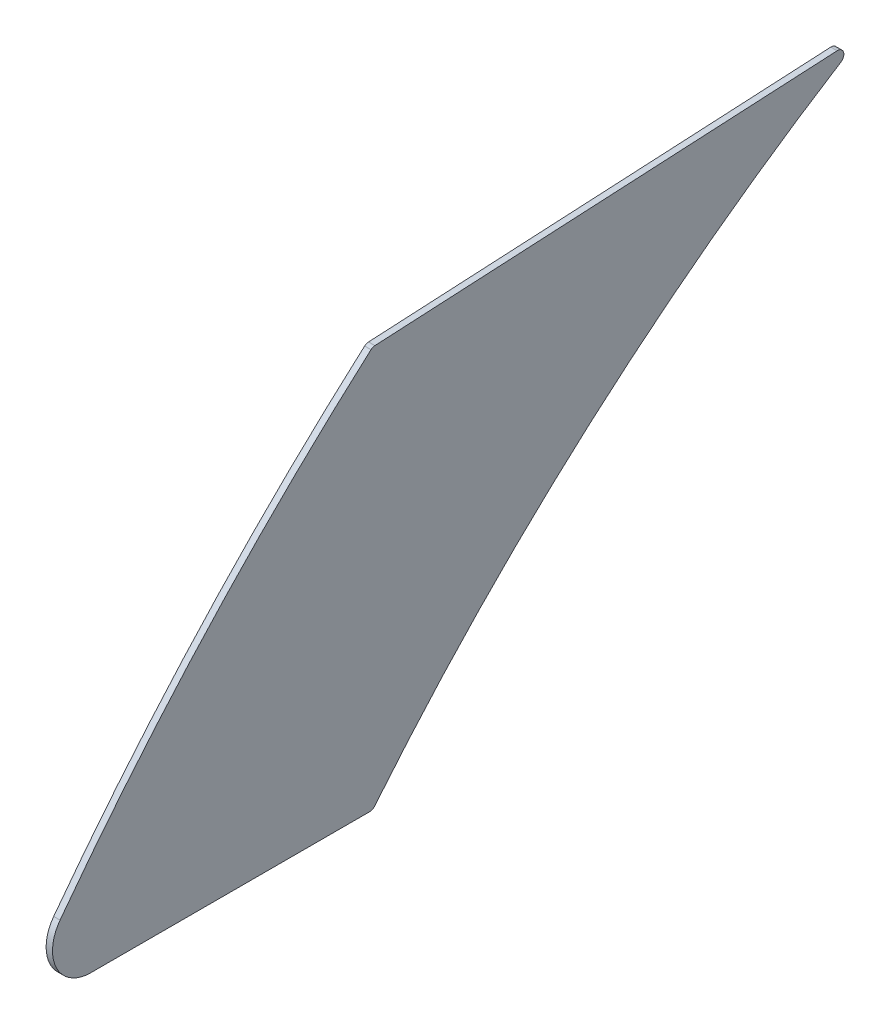
ISO-10303-21;
HEADER;
FILE_DESCRIPTION(('STEP AP214'),'2;1');
FILE_NAME('part.step','',(''),(''),'','','');
FILE_SCHEMA(('AUTOMOTIVE_DESIGN { 1 0 10303 214 1 1 1 1 }'));
ENDSEC;
DATA;
#1=APPLICATION_CONTEXT('core data for automotive mechanical design processes');
#2=APPLICATION_PROTOCOL_DEFINITION('international standard','automotive_design',2000,#1);
#3=PRODUCT_CONTEXT('',#1,'mechanical');
#4=PRODUCT('Part','Part','',(#3));
#5=PRODUCT_RELATED_PRODUCT_CATEGORY('part','',(#4));
#6=PRODUCT_DEFINITION_FORMATION('','',#4);
#7=PRODUCT_DEFINITION_CONTEXT('part definition',#1,'design');
#8=PRODUCT_DEFINITION('design','',#6,#7);
#9=PRODUCT_DEFINITION_SHAPE('','',#8);
#10=(LENGTH_UNIT() NAMED_UNIT(*) SI_UNIT(.MILLI.,.METRE.));
#11=(NAMED_UNIT(*) PLANE_ANGLE_UNIT() SI_UNIT($,.RADIAN.));
#12=(NAMED_UNIT(*) SI_UNIT($,.STERADIAN.) SOLID_ANGLE_UNIT());
#13=UNCERTAINTY_MEASURE_WITH_UNIT(LENGTH_MEASURE(1.E-05),#10,'distance_accuracy_value','');
#14=(GEOMETRIC_REPRESENTATION_CONTEXT(3) GLOBAL_UNCERTAINTY_ASSIGNED_CONTEXT((#13)) GLOBAL_UNIT_ASSIGNED_CONTEXT((#10,
#11,#12)) REPRESENTATION_CONTEXT('',''));
#15=CARTESIAN_POINT('',(0.,0.,0.));
#16=DIRECTION('',(0.,0.,1.));
#17=DIRECTION('',(1.,0.,0.));
#18=AXIS2_PLACEMENT_3D('',#15,#16,#17);
#19=CARTESIAN_POINT('',(1.,-57.,44.3054831138269));
#20=DIRECTION('',(-1.,0.,0.));
#21=DIRECTION('',(0.,0.,1.));
#22=AXIS2_PLACEMENT_3D('',#19,#20,#21);
#23=CYLINDRICAL_SURFACE('',#22,6.00000000000001);
#24=CARTESIAN_POINT('',(0.,-57.,44.3054831138269));
#25=DIRECTION('',(1.,0.,0.));
#26=DIRECTION('',(0.,0.,1.));
#27=AXIS2_PLACEMENT_3D('',#24,#25,#26);
#28=CIRCLE('',#27,6.00000000000001);
#29=CARTESIAN_POINT('',(0.,-53.4185692233311,49.11935407096));
#30=VERTEX_POINT('',#29);
#31=CARTESIAN_POINT('',(0.,-63.,44.3054831138269));
#32=VERTEX_POINT('',#31);
#33=EDGE_CURVE('E129',#30,#32,#28,.T.);
#34=ORIENTED_EDGE('',*,*,#33,.T.);
#35=DIRECTION('',(-1.,0.,0.));
#36=VECTOR('',#35,1.);
#37=CARTESIAN_POINT('',(1.,-63.,44.3054831138269));
#38=LINE('',#37,#36);
#39=CARTESIAN_POINT('',(1.,-63.,44.3054831138269));
#40=VERTEX_POINT('',#39);
#41=EDGE_CURVE('E11',#40,#32,#38,.T.);
#42=ORIENTED_EDGE('',*,*,#41,.F.);
#43=CARTESIAN_POINT('',(1.,-57.,44.3054831138269));
#44=DIRECTION('',(1.,0.,0.));
#45=DIRECTION('',(0.,0.,1.));
#46=AXIS2_PLACEMENT_3D('',#43,#44,#45);
#47=CIRCLE('',#46,6.00000000000001);
#48=CARTESIAN_POINT('',(1.,-53.4185692233311,49.11935407096));
#49=VERTEX_POINT('',#48);
#50=EDGE_CURVE('E143',#49,#40,#47,.T.);
#51=ORIENTED_EDGE('',*,*,#50,.F.);
#52=DIRECTION('',(-1.,0.,0.));
#53=VECTOR('',#52,1.);
#54=CARTESIAN_POINT('',(1.,-53.4185692233311,49.11935407096));
#55=LINE('',#54,#53);
#56=EDGE_CURVE('E125',#49,#30,#55,.T.);
#57=ORIENTED_EDGE('',*,*,#56,.T.);
#58=EDGE_LOOP('',(#34,#42,#51,#57));
#59=FACE_BOUND('',#58,.T.);
#60=ADVANCED_FACE('F33',(#59),#23,.T.);
#61=CARTESIAN_POINT('',(1.,-63.,44.3054831138269));
#62=DIRECTION('',(0.,1.,0.));
#63=DIRECTION('',(0.,0.,1.));
#64=AXIS2_PLACEMENT_3D('',#61,#62,#63);
#65=PLANE('',#64);
#66=DIRECTION('',(0.,0.,-1.));
#67=VECTOR('',#66,1.);
#68=CARTESIAN_POINT('',(0.,-63.,44.3054831138269));
#69=LINE('',#68,#67);
#70=CARTESIAN_POINT('',(0.,-63.,0.475074433169964));
#71=VERTEX_POINT('',#70);
#72=EDGE_CURVE('E132',#32,#71,#69,.T.);
#73=ORIENTED_EDGE('',*,*,#72,.T.);
#74=DIRECTION('',(-1.,0.,0.));
#75=VECTOR('',#74,1.);
#76=CARTESIAN_POINT('',(1.,-63.,0.475074433169964));
#77=LINE('',#76,#75);
#78=CARTESIAN_POINT('',(1.,-63.,0.475074433169964));
#79=VERTEX_POINT('',#78);
#80=EDGE_CURVE('E41',#79,#71,#77,.T.);
#81=ORIENTED_EDGE('',*,*,#80,.F.);
#82=DIRECTION('',(0.,0.,-1.));
#83=VECTOR('',#82,1.);
#84=CARTESIAN_POINT('',(1.,-63.,44.3054831138269));
#85=LINE('',#84,#83);
#86=EDGE_CURVE('E92',#40,#79,#85,.T.);
#87=ORIENTED_EDGE('',*,*,#86,.F.);
#88=ORIENTED_EDGE('',*,*,#41,.T.);
#89=EDGE_LOOP('',(#73,#81,#87,#88));
#90=FACE_BOUND('',#89,.T.);
#91=ADVANCED_FACE('F178',(#90),#65,.F.);
#92=CARTESIAN_POINT('',(1.,-62.,0.475074433169964));
#93=DIRECTION('',(-1.,0.,0.));
#94=DIRECTION('',(0.,0.,1.));
#95=AXIS2_PLACEMENT_3D('',#92,#93,#94);
#96=CYLINDRICAL_SURFACE('',#95,1.);
#97=CARTESIAN_POINT('',(0.,-62.,0.475074433169964));
#98=DIRECTION('',(1.,0.,0.));
#99=DIRECTION('',(0.,0.,-1.));
#100=AXIS2_PLACEMENT_3D('',#97,#98,#99);
#101=CIRCLE('',#100,1.);
#102=CARTESIAN_POINT('',(0.,-62.6323384132984,-0.299617848363327));
#103=VERTEX_POINT('',#102);
#104=EDGE_CURVE('E134',#71,#103,#101,.T.);
#105=ORIENTED_EDGE('',*,*,#104,.T.);
#106=DIRECTION('',(-1.,0.,0.));
#107=VECTOR('',#106,1.);
#108=CARTESIAN_POINT('',(1.,-62.6323384132984,-0.299617848363327));
#109=LINE('',#108,#107);
#110=CARTESIAN_POINT('',(1.,-62.6323384132984,-0.299617848363327));
#111=VERTEX_POINT('',#110);
#112=EDGE_CURVE('E150',#111,#103,#109,.T.);
#113=ORIENTED_EDGE('',*,*,#112,.F.);
#114=CARTESIAN_POINT('',(1.,-62.,0.475074433169964));
#115=DIRECTION('',(1.,0.,0.));
#116=DIRECTION('',(0.,0.,-1.));
#117=AXIS2_PLACEMENT_3D('',#114,#115,#116);
#118=CIRCLE('',#117,1.);
#119=EDGE_CURVE('E158',#79,#111,#118,.T.);
#120=ORIENTED_EDGE('',*,*,#119,.F.);
#121=ORIENTED_EDGE('',*,*,#80,.T.);
#122=EDGE_LOOP('',(#105,#113,#120,#121));
#123=FACE_BOUND('',#122,.T.);
#124=ADVANCED_FACE('F156',(#123),#96,.T.);
#125=CARTESIAN_POINT('',(1.,-252.33386240282,-232.70730230835));
#126=DIRECTION('',(-1.,0.,0.));
#127=DIRECTION('',(0.,0.,1.));
#128=AXIS2_PLACEMENT_3D('',#125,#126,#127);
#129=CYLINDRICAL_SURFACE('',#128,300.);
#130=CARTESIAN_POINT('',(0.,-252.33386240282,-232.70730230835));
#131=DIRECTION('',(-1.,0.,0.));
#132=DIRECTION('',(0.,0.,1.));
#133=AXIS2_PLACEMENT_3D('',#130,#131,#132);
#134=CIRCLE('',#133,300.);
#135=CARTESIAN_POINT('',(0.,1.97868552855796,-73.5685956256248));
#136=VERTEX_POINT('',#135);
#137=EDGE_CURVE('E136',#103,#136,#134,.T.);
#138=ORIENTED_EDGE('',*,*,#137,.T.);
#139=DIRECTION('',(-1.,0.,0.));
#140=VECTOR('',#139,1.);
#141=CARTESIAN_POINT('',(1.,1.97868552855796,-73.5685956256248));
#142=LINE('',#141,#140);
#143=CARTESIAN_POINT('',(1.,1.97868552855796,-73.5685956256248));
#144=VERTEX_POINT('',#143);
#145=EDGE_CURVE('E147',#144,#136,#142,.T.);
#146=ORIENTED_EDGE('',*,*,#145,.F.);
#147=CARTESIAN_POINT('',(1.,-252.33386240282,-232.70730230835));
#148=DIRECTION('',(-1.,0.,0.));
#149=DIRECTION('',(0.,0.,1.));
#150=AXIS2_PLACEMENT_3D('',#147,#148,#149);
#151=CIRCLE('',#150,300.);
#152=EDGE_CURVE('E170',#111,#144,#151,.T.);
#153=ORIENTED_EDGE('',*,*,#152,.F.);
#154=ORIENTED_EDGE('',*,*,#112,.T.);
#155=EDGE_LOOP('',(#138,#146,#153,#154));
#156=FACE_BOUND('',#155,.T.);
#157=ADVANCED_FACE('F166',(#156),#129,.F.);
#158=CARTESIAN_POINT('',(1.,2.82639402166245,-73.0381332700157));
#159=DIRECTION('',(-1.,0.,0.));
#160=DIRECTION('',(0.,0.,1.));
#161=AXIS2_PLACEMENT_3D('',#158,#159,#160);
#162=CYLINDRICAL_SURFACE('',#161,0.99999999999995);
#163=CARTESIAN_POINT('',(0.,2.82639402166245,-73.0381332700157));
#164=DIRECTION('',(1.,0.,0.));
#165=DIRECTION('',(0.,0.,1.));
#166=AXIS2_PLACEMENT_3D('',#163,#164,#165);
#167=CIRCLE('',#166,0.99999999999995);
#168=CARTESIAN_POINT('',(0.,3.82502355641698,-72.9857973137728));
#169=VERTEX_POINT('',#168);
#170=EDGE_CURVE('E138',#136,#169,#167,.T.);
#171=ORIENTED_EDGE('',*,*,#170,.T.);
#172=DIRECTION('',(-1.,0.,0.));
#173=VECTOR('',#172,1.);
#174=CARTESIAN_POINT('',(1.,3.82502355641698,-72.9857973137728));
#175=LINE('',#174,#173);
#176=CARTESIAN_POINT('',(1.,3.82502355641698,-72.9857973137728));
#177=VERTEX_POINT('',#176);
#178=EDGE_CURVE('E120',#177,#169,#175,.T.);
#179=ORIENTED_EDGE('',*,*,#178,.F.);
#180=CARTESIAN_POINT('',(1.,2.82639402166245,-73.0381332700157));
#181=DIRECTION('',(1.,0.,0.));
#182=DIRECTION('',(0.,0.,1.));
#183=AXIS2_PLACEMENT_3D('',#180,#181,#182);
#184=CIRCLE('',#183,0.99999999999995);
#185=EDGE_CURVE('E111',#144,#177,#184,.T.);
#186=ORIENTED_EDGE('',*,*,#185,.F.);
#187=ORIENTED_EDGE('',*,*,#145,.T.);
#188=EDGE_LOOP('',(#171,#179,#186,#187));
#189=FACE_BOUND('',#188,.T.);
#190=ADVANCED_FACE('F169',(#189),#162,.T.);
#191=CARTESIAN_POINT('',(1.,0.0182657429983053,-0.348531138853574));
#192=DIRECTION('',(0.,-0.998629534754574,-0.0523359562429444));
#193=DIRECTION('',(0.,0.0523359562429444,-0.998629534754574));
#194=AXIS2_PLACEMENT_3D('',#191,#192,#193);
#195=PLANE('',#194);
#196=DIRECTION('',(0.,-0.0523359562429444,0.998629534754574));
#197=VECTOR('',#196,1.);
#198=CARTESIAN_POINT('',(0.,0.0182657429983053,-0.348531138853574));
#199=LINE('',#198,#197);
#200=CARTESIAN_POINT('',(0.,0.0182657429983053,-0.348531138853574));
#201=VERTEX_POINT('',#200);
#202=EDGE_CURVE('E119',#169,#201,#199,.T.);
#203=ORIENTED_EDGE('',*,*,#202,.T.);
#204=DIRECTION('',(-1.,0.,0.));
#205=VECTOR('',#204,1.);
#206=CARTESIAN_POINT('',(1.,0.0182657429983053,-0.348531138853574));
#207=LINE('',#206,#205);
#208=CARTESIAN_POINT('',(1.,0.0182657429983053,-0.348531138853574));
#209=VERTEX_POINT('',#208);
#210=EDGE_CURVE('E116',#209,#201,#207,.T.);
#211=ORIENTED_EDGE('',*,*,#210,.F.);
#212=DIRECTION('',(0.,-0.0523359562429444,0.998629534754574));
#213=VECTOR('',#212,1.);
#214=CARTESIAN_POINT('',(1.,0.0182657429983053,-0.348531138853574));
#215=LINE('',#214,#213);
#216=EDGE_CURVE('E105',#177,#209,#215,.T.);
#217=ORIENTED_EDGE('',*,*,#216,.F.);
#218=ORIENTED_EDGE('',*,*,#178,.T.);
#219=EDGE_LOOP('',(#203,#211,#217,#218));
#220=FACE_BOUND('',#219,.T.);
#221=ADVANCED_FACE('F117',(#220),#195,.F.);
#222=CARTESIAN_POINT('',(1.,-0.980363791756268,-0.400867095096519));
#223=DIRECTION('',(-1.,0.,0.));
#224=DIRECTION('',(0.,0.,1.));
#225=AXIS2_PLACEMENT_3D('',#222,#223,#224);
#226=CYLINDRICAL_SURFACE('',#225,0.999999999999994);
#227=CARTESIAN_POINT('',(0.,-0.980363791756268,-0.400867095096519));
#228=DIRECTION('',(1.,0.,0.));
#229=DIRECTION('',(0.,0.,-1.));
#230=AXIS2_PLACEMENT_3D('',#227,#228,#229);
#231=CIRCLE('',#230,0.999999999999994);
#232=CARTESIAN_POINT('',(0.,-0.231495594801397,0.261851867654321));
#233=VERTEX_POINT('',#232);
#234=EDGE_CURVE('E78',#201,#233,#231,.T.);
#235=ORIENTED_EDGE('',*,*,#234,.T.);
#236=DIRECTION('',(-1.,0.,0.));
#237=VECTOR('',#236,1.);
#238=CARTESIAN_POINT('',(1.,-0.231495594801397,0.261851867654321));
#239=LINE('',#238,#237);
#240=CARTESIAN_POINT('',(1.,-0.231495594801397,0.261851867654321));
#241=VERTEX_POINT('',#240);
#242=EDGE_CURVE('E121',#241,#233,#239,.T.);
#243=ORIENTED_EDGE('',*,*,#242,.F.);
#244=CARTESIAN_POINT('',(1.,-0.980363791756268,-0.400867095096519));
#245=DIRECTION('',(1.,0.,0.));
#246=DIRECTION('',(0.,0.,-1.));
#247=AXIS2_PLACEMENT_3D('',#244,#245,#246);
#248=CIRCLE('',#247,0.999999999999994);
#249=EDGE_CURVE('E109',#209,#241,#248,.T.);
#250=ORIENTED_EDGE('',*,*,#249,.F.);
#251=ORIENTED_EDGE('',*,*,#210,.T.);
#252=EDGE_LOOP('',(#235,#243,#250,#251));
#253=FACE_BOUND('',#252,.T.);
#254=ADVANCED_FACE('F123',(#253),#226,.T.);
#255=CARTESIAN_POINT('',(1.,-262.335364529011,-231.689785095137));
#256=DIRECTION('',(-1.,0.,0.));
#257=DIRECTION('',(0.,0.,1.));
#258=AXIS2_PLACEMENT_3D('',#255,#256,#257);
#259=CYLINDRICAL_SURFACE('',#258,350.);
#260=CARTESIAN_POINT('',(0.,-262.335364529011,-231.689785095137));
#261=DIRECTION('',(1.,0.,0.));
#262=DIRECTION('',(0.,0.,1.));
#263=AXIS2_PLACEMENT_3D('',#260,#261,#262);
#264=CIRCLE('',#263,350.);
#265=EDGE_CURVE('E84',#233,#30,#264,.T.);
#266=ORIENTED_EDGE('',*,*,#265,.T.);
#267=ORIENTED_EDGE('',*,*,#56,.F.);
#268=CARTESIAN_POINT('',(1.,-262.335364529011,-231.689785095137));
#269=DIRECTION('',(1.,0.,0.));
#270=DIRECTION('',(0.,0.,1.));
#271=AXIS2_PLACEMENT_3D('',#268,#269,#270);
#272=CIRCLE('',#271,350.);
#273=EDGE_CURVE('E49',#241,#49,#272,.T.);
#274=ORIENTED_EDGE('',*,*,#273,.F.);
#275=ORIENTED_EDGE('',*,*,#242,.T.);
#276=EDGE_LOOP('',(#266,#267,#274,#275));
#277=FACE_BOUND('',#276,.T.);
#278=ADVANCED_FACE('F194',(#277),#259,.T.);
#279=CARTESIAN_POINT('',(1.,-57.,44.3054831138269));
#280=DIRECTION('',(-1.,0.,0.));
#281=DIRECTION('',(0.,0.,1.));
#282=AXIS2_PLACEMENT_3D('',#279,#280,#281);
#283=PLANE('',#282);
#284=ORIENTED_EDGE('',*,*,#50,.T.);
#285=ORIENTED_EDGE('',*,*,#86,.T.);
#286=ORIENTED_EDGE('',*,*,#119,.T.);
#287=ORIENTED_EDGE('',*,*,#152,.T.);
#288=ORIENTED_EDGE('',*,*,#185,.T.);
#289=ORIENTED_EDGE('',*,*,#216,.T.);
#290=ORIENTED_EDGE('',*,*,#249,.T.);
#291=ORIENTED_EDGE('',*,*,#273,.T.);
#292=EDGE_LOOP('',(#284,#285,#286,#287,#288,#289,#290,#291));
#293=FACE_BOUND('',#292,.T.);
#294=ADVANCED_FACE('F107',(#293),#283,.F.);
#295=CARTESIAN_POINT('',(0.,-57.,44.3054831138269));
#296=DIRECTION('',(-1.,0.,0.));
#297=DIRECTION('',(0.,0.,1.));
#298=AXIS2_PLACEMENT_3D('',#295,#296,#297);
#299=PLANE('',#298);
#300=ORIENTED_EDGE('',*,*,#33,.F.);
#301=ORIENTED_EDGE('',*,*,#265,.F.);
#302=ORIENTED_EDGE('',*,*,#234,.F.);
#303=ORIENTED_EDGE('',*,*,#202,.F.);
#304=ORIENTED_EDGE('',*,*,#170,.F.);
#305=ORIENTED_EDGE('',*,*,#137,.F.);
#306=ORIENTED_EDGE('',*,*,#104,.F.);
#307=ORIENTED_EDGE('',*,*,#72,.F.);
#308=EDGE_LOOP('',(#300,#301,#302,#303,#304,#305,#306,#307));
#309=FACE_BOUND('',#308,.T.);
#310=ADVANCED_FACE('F162',(#309),#299,.T.);
#311=CLOSED_SHELL('',(#60,#91,#124,#157,#190,#221,#254,#278,#294,#310));
#312=MANIFOLD_SOLID_BREP('B2',#311);
#313=ADVANCED_BREP_SHAPE_REPRESENTATION('',(#18,#312),#14);
#314=SHAPE_DEFINITION_REPRESENTATION(#9,#313);
ENDSEC;
END-ISO-10303-21;
